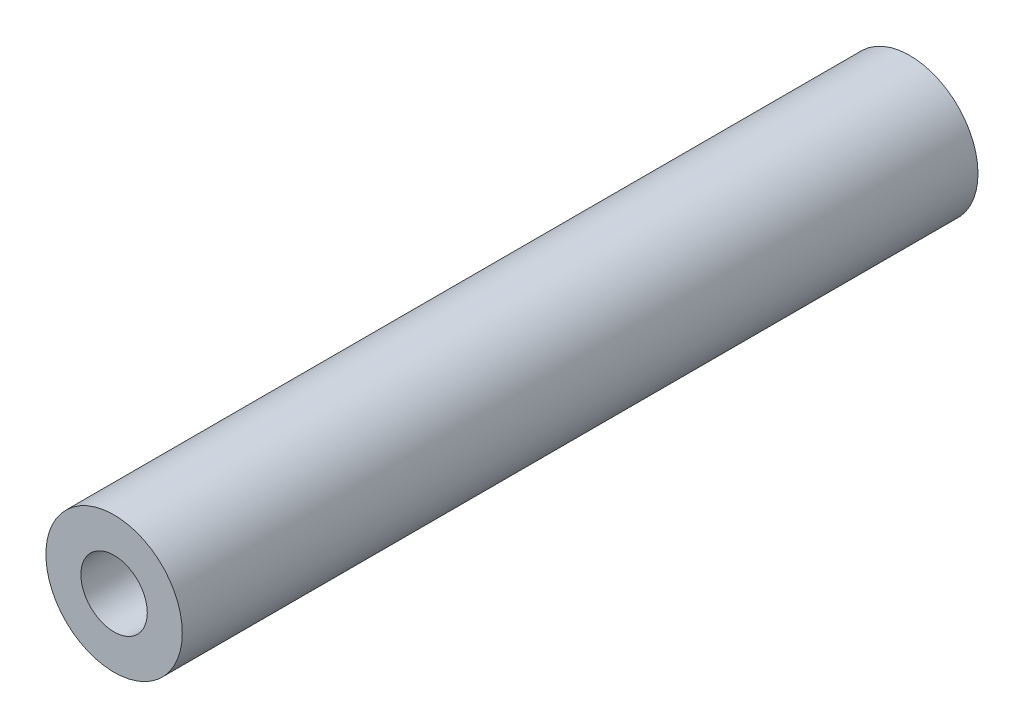
ISO-10303-21;
HEADER;
FILE_DESCRIPTION(('STEP AP214'),'2;1');
FILE_NAME('part.step','',(''),(''),'','','');
FILE_SCHEMA(('AUTOMOTIVE_DESIGN { 1 0 10303 214 1 1 1 1 }'));
ENDSEC;
DATA;
#1=APPLICATION_CONTEXT('core data for automotive mechanical design processes');
#2=APPLICATION_PROTOCOL_DEFINITION('international standard','automotive_design',2000,#1);
#3=PRODUCT_CONTEXT('',#1,'mechanical');
#4=PRODUCT('Part','Part','',(#3));
#5=PRODUCT_RELATED_PRODUCT_CATEGORY('part','',(#4));
#6=PRODUCT_DEFINITION_FORMATION('','',#4);
#7=PRODUCT_DEFINITION_CONTEXT('part definition',#1,'design');
#8=PRODUCT_DEFINITION('design','',#6,#7);
#9=PRODUCT_DEFINITION_SHAPE('','',#8);
#10=(LENGTH_UNIT() NAMED_UNIT(*) SI_UNIT(.MILLI.,.METRE.));
#11=(NAMED_UNIT(*) PLANE_ANGLE_UNIT() SI_UNIT($,.RADIAN.));
#12=(NAMED_UNIT(*) SI_UNIT($,.STERADIAN.) SOLID_ANGLE_UNIT());
#13=UNCERTAINTY_MEASURE_WITH_UNIT(LENGTH_MEASURE(1.E-05),#10,'distance_accuracy_value','');
#14=(GEOMETRIC_REPRESENTATION_CONTEXT(3) GLOBAL_UNCERTAINTY_ASSIGNED_CONTEXT((#13)) GLOBAL_UNIT_ASSIGNED_CONTEXT((#10,
#11,#12)) REPRESENTATION_CONTEXT('',''));
#15=CARTESIAN_POINT('',(0.,0.,0.));
#16=DIRECTION('',(0.,0.,1.));
#17=DIRECTION('',(1.,0.,0.));
#18=AXIS2_PLACEMENT_3D('',#15,#16,#17);
#19=CARTESIAN_POINT('',(0.,0.,-35.));
#20=DIRECTION('',(0.,0.,1.));
#21=DIRECTION('',(1.,0.,0.));
#22=AXIS2_PLACEMENT_3D('',#19,#20,#21);
#23=PLANE('',#22);
#24=CARTESIAN_POINT('',(0.,0.,-35.));
#25=DIRECTION('',(0.,0.,1.));
#26=DIRECTION('',(1.,0.,0.));
#27=AXIS2_PLACEMENT_3D('',#24,#25,#26);
#28=CIRCLE('',#27,6.);
#29=CARTESIAN_POINT('',(6.,0.,-35.));
#30=VERTEX_POINT('',#29);
#31=EDGE_CURVE('E54',#30,#30,#28,.T.);
#32=ORIENTED_EDGE('',*,*,#31,.F.);
#33=EDGE_LOOP('',(#32));
#34=FACE_BOUND('',#33,.T.);
#35=CARTESIAN_POINT('',(0.,0.,-35.));
#36=DIRECTION('',(0.,0.,1.));
#37=DIRECTION('',(1.,0.,0.));
#38=AXIS2_PLACEMENT_3D('',#35,#36,#37);
#39=CIRCLE('',#38,2.921);
#40=CARTESIAN_POINT('',(2.921,0.,-35.));
#41=VERTEX_POINT('',#40);
#42=EDGE_CURVE('E63',#41,#41,#39,.T.);
#43=ORIENTED_EDGE('',*,*,#42,.T.);
#44=EDGE_LOOP('',(#43));
#45=FACE_BOUND('',#44,.T.);
#46=ADVANCED_FACE('F33',(#34,#45),#23,.F.);
#47=CARTESIAN_POINT('',(0.,0.,35.));
#48=DIRECTION('',(0.,0.,-1.));
#49=DIRECTION('',(-1.,0.,0.));
#50=AXIS2_PLACEMENT_3D('',#47,#48,#49);
#51=CYLINDRICAL_SURFACE('',#50,6.);
#52=CARTESIAN_POINT('',(0.,0.,35.));
#53=DIRECTION('',(0.,0.,1.));
#54=DIRECTION('',(1.,0.,0.));
#55=AXIS2_PLACEMENT_3D('',#52,#53,#54);
#56=CIRCLE('',#55,6.);
#57=CARTESIAN_POINT('',(6.,0.,35.));
#58=VERTEX_POINT('',#57);
#59=EDGE_CURVE('E53',#58,#58,#56,.T.);
#60=ORIENTED_EDGE('',*,*,#59,.F.);
#61=EDGE_LOOP('',(#60));
#62=FACE_BOUND('',#61,.T.);
#63=ORIENTED_EDGE('',*,*,#31,.T.);
#64=EDGE_LOOP('',(#63));
#65=FACE_BOUND('',#64,.T.);
#66=ADVANCED_FACE('F83',(#62,#65),#51,.T.);
#67=CARTESIAN_POINT('',(0.,0.,35.));
#68=DIRECTION('',(0.,0.,1.));
#69=DIRECTION('',(1.,0.,0.));
#70=AXIS2_PLACEMENT_3D('',#67,#68,#69);
#71=PLANE('',#70);
#72=CARTESIAN_POINT('',(0.,0.,35.));
#73=DIRECTION('',(0.,0.,1.));
#74=DIRECTION('',(1.,0.,0.));
#75=AXIS2_PLACEMENT_3D('',#72,#73,#74);
#76=CIRCLE('',#75,2.921);
#77=CARTESIAN_POINT('',(2.921,0.,35.));
#78=VERTEX_POINT('',#77);
#79=EDGE_CURVE('E57',#78,#78,#76,.T.);
#80=ORIENTED_EDGE('',*,*,#79,.F.);
#81=EDGE_LOOP('',(#80));
#82=FACE_BOUND('',#81,.T.);
#83=ORIENTED_EDGE('',*,*,#59,.T.);
#84=EDGE_LOOP('',(#83));
#85=FACE_BOUND('',#84,.T.);
#86=ADVANCED_FACE('F89',(#82,#85),#71,.T.);
#87=CARTESIAN_POINT('',(0.,0.,9.6));
#88=DIRECTION('',(0.,0.,1.));
#89=DIRECTION('',(1.,0.,0.));
#90=AXIS2_PLACEMENT_3D('',#87,#88,#89);
#91=CYLINDRICAL_SURFACE('',#90,2.921);
#92=CARTESIAN_POINT('',(0.,0.,12.1));
#93=DIRECTION('',(0.,0.,1.));
#94=DIRECTION('',(1.,0.,0.));
#95=AXIS2_PLACEMENT_3D('',#92,#93,#94);
#96=CIRCLE('',#95,2.921);
#97=CARTESIAN_POINT('',(2.921,0.,12.1));
#98=VERTEX_POINT('',#97);
#99=EDGE_CURVE('E44',#98,#98,#96,.F.);
#100=ORIENTED_EDGE('',*,*,#99,.T.);
#101=EDGE_LOOP('',(#100));
#102=FACE_BOUND('',#101,.T.);
#103=ORIENTED_EDGE('',*,*,#79,.T.);
#104=EDGE_LOOP('',(#103));
#105=FACE_BOUND('',#104,.T.);
#106=ADVANCED_FACE('F79',(#102,#105),#91,.F.);
#107=CARTESIAN_POINT('',(0.,0.,9.6));
#108=DIRECTION('',(0.,0.,1.));
#109=DIRECTION('',(1.,0.,0.));
#110=AXIS2_PLACEMENT_3D('',#107,#108,#109);
#111=PLANE('',#110);
#112=CARTESIAN_POINT('',(0.,0.,9.6));
#113=DIRECTION('',(0.,0.,1.));
#114=DIRECTION('',(1.,0.,0.));
#115=AXIS2_PLACEMENT_3D('',#112,#113,#114);
#116=CIRCLE('',#115,0.421);
#117=CARTESIAN_POINT('',(0.421,0.,9.6));
#118=VERTEX_POINT('',#117);
#119=EDGE_CURVE('E48',#118,#118,#116,.T.);
#120=ORIENTED_EDGE('',*,*,#119,.T.);
#121=EDGE_LOOP('',(#120));
#122=FACE_BOUND('',#121,.T.);
#123=ADVANCED_FACE('F71',(#122),#111,.T.);
#124=CARTESIAN_POINT('',(0.,0.,-9.6));
#125=DIRECTION('',(0.,0.,-1.));
#126=DIRECTION('',(-1.,0.,0.));
#127=AXIS2_PLACEMENT_3D('',#124,#125,#126);
#128=CYLINDRICAL_SURFACE('',#127,2.921);
#129=CARTESIAN_POINT('',(0.,0.,-12.1));
#130=DIRECTION('',(0.,0.,-1.));
#131=DIRECTION('',(-1.,0.,0.));
#132=AXIS2_PLACEMENT_3D('',#129,#130,#131);
#133=CIRCLE('',#132,2.921);
#134=CARTESIAN_POINT('',(-2.921,0.,-12.1));
#135=VERTEX_POINT('',#134);
#136=EDGE_CURVE('E40',#135,#135,#133,.F.);
#137=ORIENTED_EDGE('',*,*,#136,.T.);
#138=EDGE_LOOP('',(#137));
#139=FACE_BOUND('',#138,.T.);
#140=ORIENTED_EDGE('',*,*,#42,.F.);
#141=EDGE_LOOP('',(#140));
#142=FACE_BOUND('',#141,.T.);
#143=ADVANCED_FACE('F68',(#139,#142),#128,.F.);
#144=CARTESIAN_POINT('',(0.,0.,-9.6));
#145=DIRECTION('',(0.,0.,-1.));
#146=DIRECTION('',(1.,0.,0.));
#147=AXIS2_PLACEMENT_3D('',#144,#145,#146);
#148=PLANE('',#147);
#149=CARTESIAN_POINT('',(0.,0.,-9.6));
#150=DIRECTION('',(0.,0.,-1.));
#151=DIRECTION('',(-1.,0.,0.));
#152=AXIS2_PLACEMENT_3D('',#149,#150,#151);
#153=CIRCLE('',#152,0.421);
#154=CARTESIAN_POINT('',(-0.421,0.,-9.6));
#155=VERTEX_POINT('',#154);
#156=EDGE_CURVE('E10',#155,#155,#153,.T.);
#157=ORIENTED_EDGE('',*,*,#156,.T.);
#158=EDGE_LOOP('',(#157));
#159=FACE_BOUND('',#158,.T.);
#160=ADVANCED_FACE('F70',(#159),#148,.T.);
#161=CARTESIAN_POINT('',(0.,0.,12.1));
#162=DIRECTION('',(0.,0.,1.));
#163=DIRECTION('',(1.,0.,0.));
#164=AXIS2_PLACEMENT_3D('',#161,#162,#163);
#165=DEGENERATE_TOROIDAL_SURFACE('',#164,0.421,2.5,.T.);
#166=ORIENTED_EDGE('',*,*,#99,.F.);
#167=EDGE_LOOP('',(#166));
#168=FACE_BOUND('',#167,.T.);
#169=ORIENTED_EDGE('',*,*,#119,.F.);
#170=EDGE_LOOP('',(#169));
#171=FACE_BOUND('',#170,.T.);
#172=ADVANCED_FACE('F77',(#168,#171),#165,.F.);
#173=CARTESIAN_POINT('',(0.,0.,-12.1));
#174=DIRECTION('',(0.,0.,-1.));
#175=DIRECTION('',(-1.,0.,0.));
#176=AXIS2_PLACEMENT_3D('',#173,#174,#175);
#177=DEGENERATE_TOROIDAL_SURFACE('',#176,0.421,2.5,.T.);
#178=ORIENTED_EDGE('',*,*,#156,.F.);
#179=EDGE_LOOP('',(#178));
#180=FACE_BOUND('',#179,.T.);
#181=ORIENTED_EDGE('',*,*,#136,.F.);
#182=EDGE_LOOP('',(#181));
#183=FACE_BOUND('',#182,.T.);
#184=ADVANCED_FACE('F35',(#180,#183),#177,.F.);
#185=CLOSED_SHELL('',(#46,#66,#86,#106,#123,#143,#160,#172,#184));
#186=MANIFOLD_SOLID_BREP('B2',#185);
#187=ADVANCED_BREP_SHAPE_REPRESENTATION('',(#18,#186),#14);
#188=SHAPE_DEFINITION_REPRESENTATION(#9,#187);
ENDSEC;
END-ISO-10303-21;
